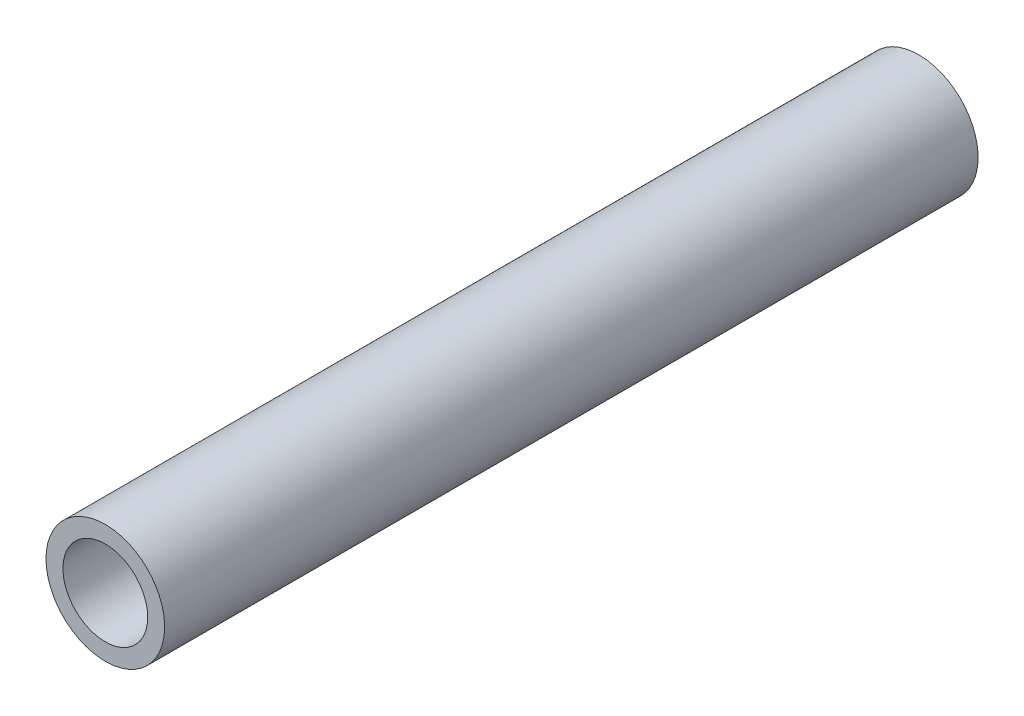
ISO-10303-21;
HEADER;
FILE_DESCRIPTION(('STEP AP214'),'2;1');
FILE_NAME('part.step','',(''),(''),'','','');
FILE_SCHEMA(('AUTOMOTIVE_DESIGN { 1 0 10303 214 1 1 1 1 }'));
ENDSEC;
DATA;
#1=APPLICATION_CONTEXT('core data for automotive mechanical design processes');
#2=APPLICATION_PROTOCOL_DEFINITION('international standard','automotive_design',2000,#1);
#3=PRODUCT_CONTEXT('',#1,'mechanical');
#4=PRODUCT('Part','Part','',(#3));
#5=PRODUCT_RELATED_PRODUCT_CATEGORY('part','',(#4));
#6=PRODUCT_DEFINITION_FORMATION('','',#4);
#7=PRODUCT_DEFINITION_CONTEXT('part definition',#1,'design');
#8=PRODUCT_DEFINITION('design','',#6,#7);
#9=PRODUCT_DEFINITION_SHAPE('','',#8);
#10=(LENGTH_UNIT() NAMED_UNIT(*) SI_UNIT(.MILLI.,.METRE.));
#11=(NAMED_UNIT(*) PLANE_ANGLE_UNIT() SI_UNIT($,.RADIAN.));
#12=(NAMED_UNIT(*) SI_UNIT($,.STERADIAN.) SOLID_ANGLE_UNIT());
#13=UNCERTAINTY_MEASURE_WITH_UNIT(LENGTH_MEASURE(1.E-05),#10,'distance_accuracy_value','');
#14=(GEOMETRIC_REPRESENTATION_CONTEXT(3) GLOBAL_UNCERTAINTY_ASSIGNED_CONTEXT((#13)) GLOBAL_UNIT_ASSIGNED_CONTEXT((#10,
#11,#12)) REPRESENTATION_CONTEXT('',''));
#15=CARTESIAN_POINT('',(0.,0.,0.));
#16=DIRECTION('',(0.,0.,1.));
#17=DIRECTION('',(1.,0.,0.));
#18=AXIS2_PLACEMENT_3D('',#15,#16,#17);
#19=CARTESIAN_POINT('',(0.,0.,121.92));
#20=DIRECTION('',(0.,0.,-1.));
#21=DIRECTION('',(-1.,0.,0.));
#22=AXIS2_PLACEMENT_3D('',#19,#20,#21);
#23=CYLINDRICAL_SURFACE('',#22,8.89);
#24=CARTESIAN_POINT('',(0.,0.,121.92));
#25=DIRECTION('',(0.,0.,1.));
#26=DIRECTION('',(1.,0.,0.));
#27=AXIS2_PLACEMENT_3D('',#24,#25,#26);
#28=CIRCLE('',#27,8.89);
#29=CARTESIAN_POINT('',(-8.89,0.,121.92));
#30=VERTEX_POINT('',#29);
#31=EDGE_CURVE('E10',#30,#30,#28,.T.);
#32=CARTESIAN_POINT('',(0.,0.,0.));
#33=DIRECTION('',(0.,0.,1.));
#34=DIRECTION('',(1.,0.,0.));
#35=AXIS2_PLACEMENT_3D('',#32,#33,#34);
#36=CIRCLE('',#35,8.89);
#37=CARTESIAN_POINT('',(-8.89,0.,0.));
#38=VERTEX_POINT('',#37);
#39=EDGE_CURVE('E33',#38,#38,#36,.T.);
#40=CARTESIAN_POINT('',(-8.89,0.,121.92));
#41=CARTESIAN_POINT('',(-8.89,0.,120.65));
#42=CARTESIAN_POINT('',(-8.89,0.,119.38));
#43=CARTESIAN_POINT('',(-8.89,0.,116.84));
#44=CARTESIAN_POINT('',(-8.89,0.,115.57));
#45=CARTESIAN_POINT('',(-8.89,0.,113.03));
#46=CARTESIAN_POINT('',(-8.89,0.,111.76));
#47=CARTESIAN_POINT('',(-8.89,0.,109.22));
#48=CARTESIAN_POINT('',(-8.89,0.,107.95));
#49=CARTESIAN_POINT('',(-8.89,0.,105.41));
#50=CARTESIAN_POINT('',(-8.89,0.,104.14));
#51=CARTESIAN_POINT('',(-8.89,0.,101.6));
#52=CARTESIAN_POINT('',(-8.89,0.,100.33));
#53=CARTESIAN_POINT('',(-8.89,0.,97.79));
#54=CARTESIAN_POINT('',(-8.89,0.,96.52));
#55=CARTESIAN_POINT('',(-8.89,0.,93.98));
#56=CARTESIAN_POINT('',(-8.89,0.,92.71));
#57=CARTESIAN_POINT('',(-8.89,0.,90.17));
#58=CARTESIAN_POINT('',(-8.89,0.,88.9));
#59=CARTESIAN_POINT('',(-8.89,0.,86.36));
#60=CARTESIAN_POINT('',(-8.89,0.,85.09));
#61=CARTESIAN_POINT('',(-8.89,0.,82.55));
#62=CARTESIAN_POINT('',(-8.89,0.,81.28));
#63=CARTESIAN_POINT('',(-8.89,0.,78.74));
#64=CARTESIAN_POINT('',(-8.89,0.,77.47));
#65=CARTESIAN_POINT('',(-8.89,0.,74.93));
#66=CARTESIAN_POINT('',(-8.89,0.,73.66));
#67=CARTESIAN_POINT('',(-8.89,0.,71.12));
#68=CARTESIAN_POINT('',(-8.89,0.,69.85));
#69=CARTESIAN_POINT('',(-8.89,0.,67.31));
#70=CARTESIAN_POINT('',(-8.89,0.,66.04));
#71=CARTESIAN_POINT('',(-8.89,0.,63.5));
#72=CARTESIAN_POINT('',(-8.89,0.,62.23));
#73=CARTESIAN_POINT('',(-8.89,0.,59.69));
#74=CARTESIAN_POINT('',(-8.89,0.,58.42));
#75=CARTESIAN_POINT('',(-8.89,0.,55.88));
#76=CARTESIAN_POINT('',(-8.89,0.,54.61));
#77=CARTESIAN_POINT('',(-8.89,0.,52.07));
#78=CARTESIAN_POINT('',(-8.89,0.,50.8));
#79=CARTESIAN_POINT('',(-8.89,0.,48.26));
#80=CARTESIAN_POINT('',(-8.89,0.,46.99));
#81=CARTESIAN_POINT('',(-8.89,0.,44.45));
#82=CARTESIAN_POINT('',(-8.89,0.,43.18));
#83=CARTESIAN_POINT('',(-8.89,0.,40.64));
#84=CARTESIAN_POINT('',(-8.89,0.,39.37));
#85=CARTESIAN_POINT('',(-8.89,0.,36.83));
#86=CARTESIAN_POINT('',(-8.89,0.,35.56));
#87=CARTESIAN_POINT('',(-8.89,0.,33.02));
#88=CARTESIAN_POINT('',(-8.89,0.,31.75));
#89=CARTESIAN_POINT('',(-8.89,0.,29.21));
#90=CARTESIAN_POINT('',(-8.89,0.,27.94));
#91=CARTESIAN_POINT('',(-8.89,0.,25.4));
#92=CARTESIAN_POINT('',(-8.89,0.,24.13));
#93=CARTESIAN_POINT('',(-8.89,0.,21.59));
#94=CARTESIAN_POINT('',(-8.89,0.,20.32));
#95=CARTESIAN_POINT('',(-8.89,0.,17.78));
#96=CARTESIAN_POINT('',(-8.89,0.,16.51));
#97=CARTESIAN_POINT('',(-8.89,0.,13.97));
#98=CARTESIAN_POINT('',(-8.89,0.,12.7));
#99=CARTESIAN_POINT('',(-8.89,0.,10.16));
#100=CARTESIAN_POINT('',(-8.89,0.,8.89));
#101=CARTESIAN_POINT('',(-8.89,0.,6.35));
#102=CARTESIAN_POINT('',(-8.89,0.,5.08));
#103=CARTESIAN_POINT('',(-8.89,0.,2.54));
#104=CARTESIAN_POINT('',(-8.89,0.,1.27));
#105=CARTESIAN_POINT('',(-8.89,0.,0.));
#106=B_SPLINE_CURVE_WITH_KNOTS('',3,(#40,#41,#42,#43,#44,#45,#46,#47,#48,#49,#50,#51,#52,#53,
#54,#55,#56,#57,#58,#59,#60,#61,#62,#63,#64,#65,#66,#67,#68,#69,#70,#71,#72,#73,#74,#75,#76,#77,
#78,#79,#80,#81,#82,#83,#84,#85,#86,#87,#88,#89,#90,#91,#92,#93,#94,#95,#96,#97,#98,#99,#100,
#101,#102,#103,#104,#105),.UNSPECIFIED.,.F.,.F.,(4,2,2,2,2,2,2,2,2,2,2,2,2,2,2,2,2,2,2,2,2,2,2,
2,2,2,2,2,2,2,2,2,4),(0.,3.81000000000001,7.62,11.43,15.24,19.05,22.86,26.67,30.48,34.29,38.1,
41.91,45.72,49.53,53.34,57.15,60.96,64.77,68.58,72.39,76.2,80.01,83.82,87.63,91.44,95.25,99.06,
102.87,106.68,110.49,114.3,118.11,121.92),.UNSPECIFIED.);
#107=EDGE_CURVE('BSEAM30',#30,#38,#106,.T.);
#108=ORIENTED_EDGE('',*,*,#31,.F.);
#109=ORIENTED_EDGE('',*,*,#39,.T.);
#110=ORIENTED_EDGE('',*,*,#107,.T.);
#111=ORIENTED_EDGE('',*,*,#107,.F.);
#112=EDGE_LOOP('',(#108,#110,#109,#111));
#113=FACE_BOUND('',#112,.T.);
#114=ADVANCED_FACE('F30',(#113),#23,.T.);
#115=CARTESIAN_POINT('',(0.,0.,121.92));
#116=DIRECTION('',(0.,0.,1.));
#117=DIRECTION('',(1.,0.,0.));
#118=AXIS2_PLACEMENT_3D('',#115,#116,#117);
#119=PLANE('',#118);
#120=CARTESIAN_POINT('',(0.,0.,121.92));
#121=DIRECTION('',(0.,0.,1.));
#122=DIRECTION('',(1.,0.,0.));
#123=AXIS2_PLACEMENT_3D('',#120,#121,#122);
#124=CIRCLE('',#123,6.35);
#125=CARTESIAN_POINT('',(6.35,0.,121.92));
#126=VERTEX_POINT('',#125);
#127=EDGE_CURVE('E42',#126,#126,#124,.T.);
#128=ORIENTED_EDGE('',*,*,#127,.F.);
#129=EDGE_LOOP('',(#128));
#130=FACE_BOUND('',#129,.T.);
#131=ORIENTED_EDGE('',*,*,#31,.T.);
#132=EDGE_LOOP('',(#131));
#133=FACE_BOUND('',#132,.T.);
#134=ADVANCED_FACE('F57',(#130,#133),#119,.T.);
#135=CARTESIAN_POINT('',(0.,0.,0.));
#136=DIRECTION('',(0.,0.,1.));
#137=DIRECTION('',(1.,0.,0.));
#138=AXIS2_PLACEMENT_3D('',#135,#136,#137);
#139=PLANE('',#138);
#140=CARTESIAN_POINT('',(0.,0.,0.));
#141=DIRECTION('',(0.,0.,1.));
#142=DIRECTION('',(1.,0.,0.));
#143=AXIS2_PLACEMENT_3D('',#140,#141,#142);
#144=CIRCLE('',#143,6.35);
#145=CARTESIAN_POINT('',(6.35,0.,0.));
#146=VERTEX_POINT('',#145);
#147=EDGE_CURVE('E40',#146,#146,#144,.T.);
#148=ORIENTED_EDGE('',*,*,#147,.T.);
#149=EDGE_LOOP('',(#148));
#150=FACE_BOUND('',#149,.T.);
#151=ORIENTED_EDGE('',*,*,#39,.F.);
#152=EDGE_LOOP('',(#151));
#153=FACE_BOUND('',#152,.T.);
#154=ADVANCED_FACE('F48',(#150,#153),#139,.F.);
#155=CARTESIAN_POINT('',(0.,0.,0.));
#156=DIRECTION('',(0.,0.,1.));
#157=DIRECTION('',(1.,0.,0.));
#158=AXIS2_PLACEMENT_3D('',#155,#156,#157);
#159=CYLINDRICAL_SURFACE('',#158,6.35);
#160=CARTESIAN_POINT('',(6.35,0.,0.));
#161=CARTESIAN_POINT('',(6.35,0.,1.27));
#162=CARTESIAN_POINT('',(6.35,0.,2.54));
#163=CARTESIAN_POINT('',(6.35,0.,5.08));
#164=CARTESIAN_POINT('',(6.35,0.,6.35));
#165=CARTESIAN_POINT('',(6.35,0.,8.89));
#166=CARTESIAN_POINT('',(6.35,0.,10.16));
#167=CARTESIAN_POINT('',(6.35,0.,12.7));
#168=CARTESIAN_POINT('',(6.35,0.,13.97));
#169=CARTESIAN_POINT('',(6.35,0.,16.51));
#170=CARTESIAN_POINT('',(6.35,0.,17.78));
#171=CARTESIAN_POINT('',(6.35,0.,20.32));
#172=CARTESIAN_POINT('',(6.35,0.,21.59));
#173=CARTESIAN_POINT('',(6.35,0.,24.13));
#174=CARTESIAN_POINT('',(6.35,0.,25.4));
#175=CARTESIAN_POINT('',(6.35,0.,27.94));
#176=CARTESIAN_POINT('',(6.35,0.,29.21));
#177=CARTESIAN_POINT('',(6.35,0.,31.75));
#178=CARTESIAN_POINT('',(6.35,0.,33.02));
#179=CARTESIAN_POINT('',(6.35,0.,35.56));
#180=CARTESIAN_POINT('',(6.35,0.,36.83));
#181=CARTESIAN_POINT('',(6.35,0.,39.37));
#182=CARTESIAN_POINT('',(6.35,0.,40.64));
#183=CARTESIAN_POINT('',(6.35,0.,43.18));
#184=CARTESIAN_POINT('',(6.35,0.,44.45));
#185=CARTESIAN_POINT('',(6.35,0.,46.99));
#186=CARTESIAN_POINT('',(6.35,0.,48.26));
#187=CARTESIAN_POINT('',(6.35,0.,50.8));
#188=CARTESIAN_POINT('',(6.35,0.,52.07));
#189=CARTESIAN_POINT('',(6.35,0.,54.61));
#190=CARTESIAN_POINT('',(6.35,0.,55.88));
#191=CARTESIAN_POINT('',(6.35,0.,58.42));
#192=CARTESIAN_POINT('',(6.35,0.,59.69));
#193=CARTESIAN_POINT('',(6.35,0.,62.23));
#194=CARTESIAN_POINT('',(6.35,0.,63.5));
#195=CARTESIAN_POINT('',(6.35,0.,66.04));
#196=CARTESIAN_POINT('',(6.35,0.,67.31));
#197=CARTESIAN_POINT('',(6.35,0.,69.85));
#198=CARTESIAN_POINT('',(6.35,0.,71.12));
#199=CARTESIAN_POINT('',(6.35,0.,73.66));
#200=CARTESIAN_POINT('',(6.35,0.,74.93));
#201=CARTESIAN_POINT('',(6.35,0.,77.47));
#202=CARTESIAN_POINT('',(6.35,0.,78.74));
#203=CARTESIAN_POINT('',(6.35,0.,81.28));
#204=CARTESIAN_POINT('',(6.35,0.,82.55));
#205=CARTESIAN_POINT('',(6.35,0.,85.09));
#206=CARTESIAN_POINT('',(6.35,0.,86.36));
#207=CARTESIAN_POINT('',(6.35,0.,88.9));
#208=CARTESIAN_POINT('',(6.35,0.,90.17));
#209=CARTESIAN_POINT('',(6.35,0.,92.71));
#210=CARTESIAN_POINT('',(6.35,0.,93.98));
#211=CARTESIAN_POINT('',(6.35,0.,96.52));
#212=CARTESIAN_POINT('',(6.35,0.,97.79));
#213=CARTESIAN_POINT('',(6.35,0.,100.33));
#214=CARTESIAN_POINT('',(6.35,0.,101.6));
#215=CARTESIAN_POINT('',(6.35,0.,104.14));
#216=CARTESIAN_POINT('',(6.35,0.,105.41));
#217=CARTESIAN_POINT('',(6.35,0.,107.95));
#218=CARTESIAN_POINT('',(6.35,0.,109.22));
#219=CARTESIAN_POINT('',(6.35,0.,111.76));
#220=CARTESIAN_POINT('',(6.35,0.,113.03));
#221=CARTESIAN_POINT('',(6.35,0.,115.57));
#222=CARTESIAN_POINT('',(6.35,0.,116.84));
#223=CARTESIAN_POINT('',(6.35,0.,119.38));
#224=CARTESIAN_POINT('',(6.35,0.,120.65));
#225=CARTESIAN_POINT('',(6.35,0.,121.92));
#226=B_SPLINE_CURVE_WITH_KNOTS('',3,(#160,#161,#162,#163,#164,#165,#166,#167,#168,#169,#170,
#171,#172,#173,#174,#175,#176,#177,#178,#179,#180,#181,#182,#183,#184,#185,#186,#187,#188,#189,
#190,#191,#192,#193,#194,#195,#196,#197,#198,#199,#200,#201,#202,#203,#204,#205,#206,#207,#208,
#209,#210,#211,#212,#213,#214,#215,#216,#217,#218,#219,#220,#221,#222,#223,#224,#225),
.UNSPECIFIED.,.F.,.F.,(4,2,2,2,2,2,2,2,2,2,2,2,2,2,2,2,2,2,2,2,2,2,2,2,2,2,2,2,2,2,2,2,4),(0.,
3.81,7.62,11.43,15.24,19.05,22.86,26.67,30.48,34.29,38.1,41.91,45.72,49.53,53.34,57.15,60.96,
64.77,68.58,72.39,76.2,80.01,83.82,87.63,91.44,95.25,99.06,102.87,106.68,110.49,114.3,118.11,
121.92),.UNSPECIFIED.);
#227=EDGE_CURVE('BSEAM51',#146,#126,#226,.T.);
#228=ORIENTED_EDGE('',*,*,#147,.F.);
#229=ORIENTED_EDGE('',*,*,#127,.T.);
#230=ORIENTED_EDGE('',*,*,#227,.T.);
#231=ORIENTED_EDGE('',*,*,#227,.F.);
#232=EDGE_LOOP('',(#228,#230,#229,#231));
#233=FACE_BOUND('',#232,.T.);
#234=ADVANCED_FACE('F51',(#233),#159,.F.);
#235=CLOSED_SHELL('',(#114,#134,#154,#234));
#236=MANIFOLD_SOLID_BREP('B2',#235);
#237=ADVANCED_BREP_SHAPE_REPRESENTATION('',(#18,#236),#14);
#238=SHAPE_DEFINITION_REPRESENTATION(#9,#237);
ENDSEC;
END-ISO-10303-21;
